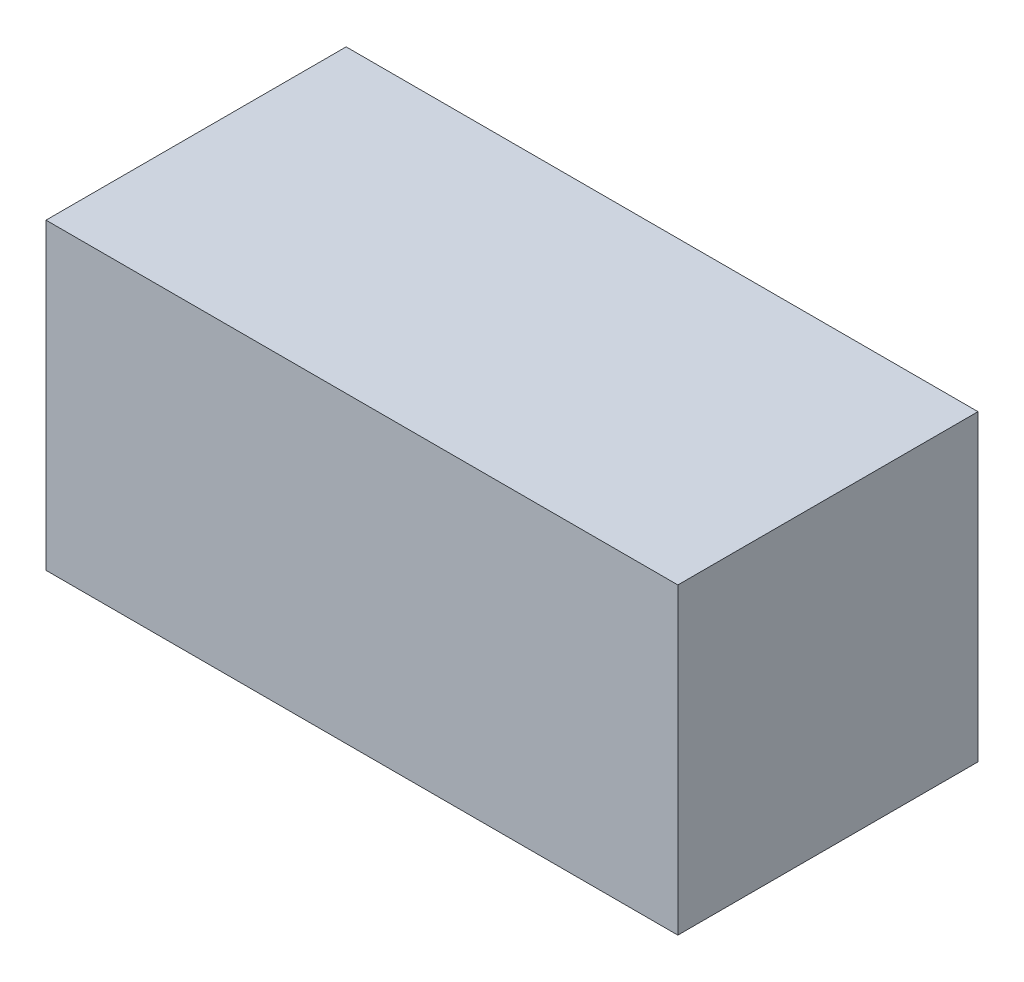
ISO-10303-21;
HEADER;
FILE_DESCRIPTION(('STEP AP214'),'2;1');
FILE_NAME('part.step','',(''),(''),'','','');
FILE_SCHEMA(('AUTOMOTIVE_DESIGN { 1 0 10303 214 1 1 1 1 }'));
ENDSEC;
DATA;
#1=APPLICATION_CONTEXT('core data for automotive mechanical design processes');
#2=APPLICATION_PROTOCOL_DEFINITION('international standard','automotive_design',2000,#1);
#3=PRODUCT_CONTEXT('',#1,'mechanical');
#4=PRODUCT('Part','Part','',(#3));
#5=PRODUCT_RELATED_PRODUCT_CATEGORY('part','',(#4));
#6=PRODUCT_DEFINITION_FORMATION('','',#4);
#7=PRODUCT_DEFINITION_CONTEXT('part definition',#1,'design');
#8=PRODUCT_DEFINITION('design','',#6,#7);
#9=PRODUCT_DEFINITION_SHAPE('','',#8);
#10=(LENGTH_UNIT() NAMED_UNIT(*) SI_UNIT(.MILLI.,.METRE.));
#11=(NAMED_UNIT(*) PLANE_ANGLE_UNIT() SI_UNIT($,.RADIAN.));
#12=(NAMED_UNIT(*) SI_UNIT($,.STERADIAN.) SOLID_ANGLE_UNIT());
#13=UNCERTAINTY_MEASURE_WITH_UNIT(LENGTH_MEASURE(1.E-05),#10,'distance_accuracy_value','');
#14=(GEOMETRIC_REPRESENTATION_CONTEXT(3) GLOBAL_UNCERTAINTY_ASSIGNED_CONTEXT((#13)) GLOBAL_UNIT_ASSIGNED_CONTEXT((#10,
#11,#12)) REPRESENTATION_CONTEXT('',''));
#15=CARTESIAN_POINT('',(0.,0.,0.));
#16=DIRECTION('',(0.,0.,1.));
#17=DIRECTION('',(1.,0.,0.));
#18=AXIS2_PLACEMENT_3D('',#15,#16,#17);
#19=CARTESIAN_POINT('',(-1.,0.48,0.95));
#20=DIRECTION('',(1.,0.,0.));
#21=DIRECTION('',(0.,0.,-1.));
#22=AXIS2_PLACEMENT_3D('',#19,#20,#21);
#23=PLANE('',#22);
#24=DIRECTION('',(0.,-1.,0.));
#25=VECTOR('',#24,1.);
#26=CARTESIAN_POINT('',(-1.,0.48,0.));
#27=LINE('',#26,#25);
#28=CARTESIAN_POINT('',(-1.,0.48,0.));
#29=VERTEX_POINT('',#28);
#30=CARTESIAN_POINT('',(-1.,-0.48,0.));
#31=VERTEX_POINT('',#30);
#32=EDGE_CURVE('E97',#29,#31,#27,.T.);
#33=ORIENTED_EDGE('',*,*,#32,.T.);
#34=DIRECTION('',(0.,0.,-1.));
#35=VECTOR('',#34,1.);
#36=CARTESIAN_POINT('',(-1.,-0.48,0.95));
#37=LINE('',#36,#35);
#38=CARTESIAN_POINT('',(-1.,-0.48,0.95));
#39=VERTEX_POINT('',#38);
#40=EDGE_CURVE('E11',#39,#31,#37,.T.);
#41=ORIENTED_EDGE('',*,*,#40,.F.);
#42=DIRECTION('',(0.,-1.,0.));
#43=VECTOR('',#42,1.);
#44=CARTESIAN_POINT('',(-1.,0.48,0.95));
#45=LINE('',#44,#43);
#46=CARTESIAN_POINT('',(-1.,0.48,0.95));
#47=VERTEX_POINT('',#46);
#48=EDGE_CURVE('E85',#47,#39,#45,.T.);
#49=ORIENTED_EDGE('',*,*,#48,.F.);
#50=DIRECTION('',(0.,0.,-1.));
#51=VECTOR('',#50,1.);
#52=CARTESIAN_POINT('',(-1.,0.48,0.95));
#53=LINE('',#52,#51);
#54=EDGE_CURVE('E93',#47,#29,#53,.T.);
#55=ORIENTED_EDGE('',*,*,#54,.T.);
#56=EDGE_LOOP('',(#33,#41,#49,#55));
#57=FACE_BOUND('',#56,.T.);
#58=ADVANCED_FACE('F34',(#57),#23,.F.);
#59=CARTESIAN_POINT('',(-1.,-0.48,0.95));
#60=DIRECTION('',(0.,1.,0.));
#61=DIRECTION('',(0.,0.,1.));
#62=AXIS2_PLACEMENT_3D('',#59,#60,#61);
#63=PLANE('',#62);
#64=DIRECTION('',(1.,0.,0.));
#65=VECTOR('',#64,1.);
#66=CARTESIAN_POINT('',(-1.,-0.48,0.));
#67=LINE('',#66,#65);
#68=CARTESIAN_POINT('',(1.,-0.48,0.));
#69=VERTEX_POINT('',#68);
#70=EDGE_CURVE('E89',#31,#69,#67,.T.);
#71=ORIENTED_EDGE('',*,*,#70,.T.);
#72=DIRECTION('',(0.,0.,-1.));
#73=VECTOR('',#72,1.);
#74=CARTESIAN_POINT('',(1.,-0.48,0.95));
#75=LINE('',#74,#73);
#76=CARTESIAN_POINT('',(1.,-0.48,0.95));
#77=VERTEX_POINT('',#76);
#78=EDGE_CURVE('E42',#77,#69,#75,.T.);
#79=ORIENTED_EDGE('',*,*,#78,.F.);
#80=DIRECTION('',(1.,0.,0.));
#81=VECTOR('',#80,1.);
#82=CARTESIAN_POINT('',(-1.,-0.48,0.95));
#83=LINE('',#82,#81);
#84=EDGE_CURVE('E80',#39,#77,#83,.T.);
#85=ORIENTED_EDGE('',*,*,#84,.F.);
#86=ORIENTED_EDGE('',*,*,#40,.T.);
#87=EDGE_LOOP('',(#71,#79,#85,#86));
#88=FACE_BOUND('',#87,.T.);
#89=ADVANCED_FACE('F88',(#88),#63,.F.);
#90=CARTESIAN_POINT('',(1.,-0.48,0.95));
#91=DIRECTION('',(-1.,0.,0.));
#92=DIRECTION('',(0.,0.,1.));
#93=AXIS2_PLACEMENT_3D('',#90,#91,#92);
#94=PLANE('',#93);
#95=DIRECTION('',(0.,1.,0.));
#96=VECTOR('',#95,1.);
#97=CARTESIAN_POINT('',(1.,-0.48,0.));
#98=LINE('',#97,#96);
#99=CARTESIAN_POINT('',(1.,0.48,0.));
#100=VERTEX_POINT('',#99);
#101=EDGE_CURVE('E67',#69,#100,#98,.T.);
#102=ORIENTED_EDGE('',*,*,#101,.T.);
#103=DIRECTION('',(0.,0.,-1.));
#104=VECTOR('',#103,1.);
#105=CARTESIAN_POINT('',(1.,0.48,0.95));
#106=LINE('',#105,#104);
#107=CARTESIAN_POINT('',(1.,0.48,0.95));
#108=VERTEX_POINT('',#107);
#109=EDGE_CURVE('E90',#108,#100,#106,.T.);
#110=ORIENTED_EDGE('',*,*,#109,.F.);
#111=DIRECTION('',(0.,1.,0.));
#112=VECTOR('',#111,1.);
#113=CARTESIAN_POINT('',(1.,-0.48,0.95));
#114=LINE('',#113,#112);
#115=EDGE_CURVE('E83',#77,#108,#114,.T.);
#116=ORIENTED_EDGE('',*,*,#115,.F.);
#117=ORIENTED_EDGE('',*,*,#78,.T.);
#118=EDGE_LOOP('',(#102,#110,#116,#117));
#119=FACE_BOUND('',#118,.T.);
#120=ADVANCED_FACE('F91',(#119),#94,.F.);
#121=CARTESIAN_POINT('',(1.,0.48,0.95));
#122=DIRECTION('',(0.,-1.,0.));
#123=DIRECTION('',(0.,0.,-1.));
#124=AXIS2_PLACEMENT_3D('',#121,#122,#123);
#125=PLANE('',#124);
#126=DIRECTION('',(-1.,0.,0.));
#127=VECTOR('',#126,1.);
#128=CARTESIAN_POINT('',(1.,0.48,0.));
#129=LINE('',#128,#127);
#130=EDGE_CURVE('E73',#100,#29,#129,.T.);
#131=ORIENTED_EDGE('',*,*,#130,.T.);
#132=ORIENTED_EDGE('',*,*,#54,.F.);
#133=DIRECTION('',(-1.,0.,0.));
#134=VECTOR('',#133,1.);
#135=CARTESIAN_POINT('',(1.,0.48,0.95));
#136=LINE('',#135,#134);
#137=EDGE_CURVE('E50',#108,#47,#136,.T.);
#138=ORIENTED_EDGE('',*,*,#137,.F.);
#139=ORIENTED_EDGE('',*,*,#109,.T.);
#140=EDGE_LOOP('',(#131,#132,#138,#139));
#141=FACE_BOUND('',#140,.T.);
#142=ADVANCED_FACE('F104',(#141),#125,.F.);
#143=CARTESIAN_POINT('',(0.,0.,0.95));
#144=DIRECTION('',(0.,0.,1.));
#145=DIRECTION('',(1.,0.,0.));
#146=AXIS2_PLACEMENT_3D('',#143,#144,#145);
#147=PLANE('',#146);
#148=ORIENTED_EDGE('',*,*,#48,.T.);
#149=ORIENTED_EDGE('',*,*,#84,.T.);
#150=ORIENTED_EDGE('',*,*,#115,.T.);
#151=ORIENTED_EDGE('',*,*,#137,.T.);
#152=EDGE_LOOP('',(#148,#149,#150,#151));
#153=FACE_BOUND('',#152,.T.);
#154=ADVANCED_FACE('F81',(#153),#147,.T.);
#155=CARTESIAN_POINT('',(0.,0.,0.));
#156=DIRECTION('',(0.,0.,1.));
#157=DIRECTION('',(1.,0.,0.));
#158=AXIS2_PLACEMENT_3D('',#155,#156,#157);
#159=PLANE('',#158);
#160=ORIENTED_EDGE('',*,*,#32,.F.);
#161=ORIENTED_EDGE('',*,*,#130,.F.);
#162=ORIENTED_EDGE('',*,*,#101,.F.);
#163=ORIENTED_EDGE('',*,*,#70,.F.);
#164=EDGE_LOOP('',(#160,#161,#162,#163));
#165=FACE_BOUND('',#164,.T.);
#166=ADVANCED_FACE('F107',(#165),#159,.F.);
#167=CLOSED_SHELL('',(#58,#89,#120,#142,#154,#166));
#168=MANIFOLD_SOLID_BREP('B2',#167);
#169=ADVANCED_BREP_SHAPE_REPRESENTATION('',(#18,#168),#14);
#170=SHAPE_DEFINITION_REPRESENTATION(#9,#169);
ENDSEC;
END-ISO-10303-21;
